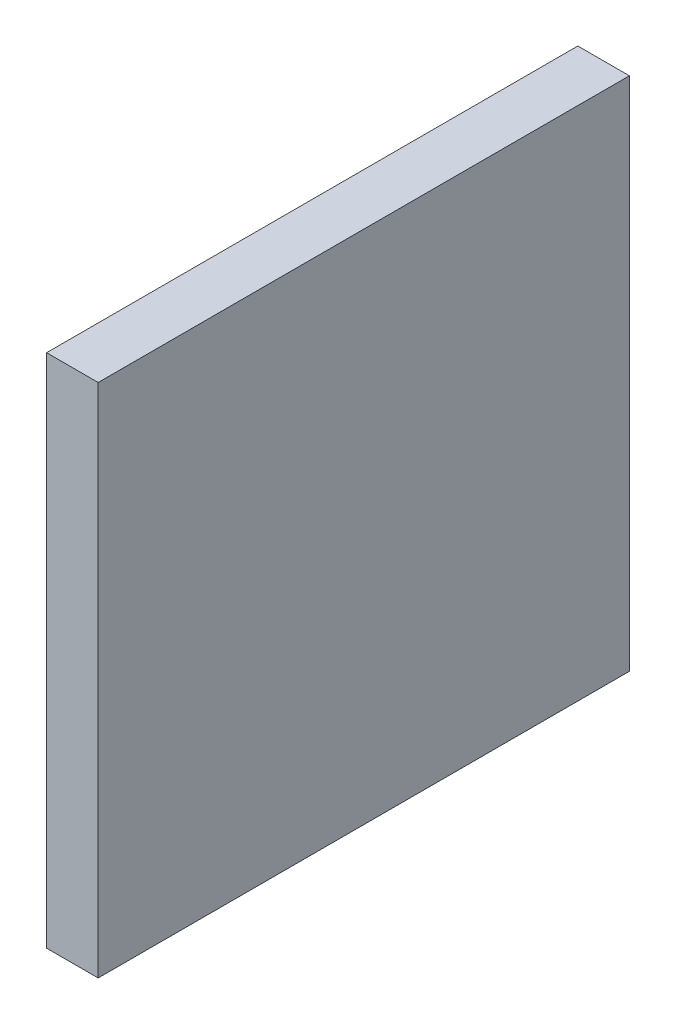
ISO-10303-21;
HEADER;
FILE_DESCRIPTION(('STEP AP214'),'2;1');
FILE_NAME('part.step','',(''),(''),'','','');
FILE_SCHEMA(('AUTOMOTIVE_DESIGN { 1 0 10303 214 1 1 1 1 }'));
ENDSEC;
DATA;
#1=APPLICATION_CONTEXT('core data for automotive mechanical design processes');
#2=APPLICATION_PROTOCOL_DEFINITION('international standard','automotive_design',2000,#1);
#3=PRODUCT_CONTEXT('',#1,'mechanical');
#4=PRODUCT('Part','Part','',(#3));
#5=PRODUCT_RELATED_PRODUCT_CATEGORY('part','',(#4));
#6=PRODUCT_DEFINITION_FORMATION('','',#4);
#7=PRODUCT_DEFINITION_CONTEXT('part definition',#1,'design');
#8=PRODUCT_DEFINITION('design','',#6,#7);
#9=PRODUCT_DEFINITION_SHAPE('','',#8);
#10=(LENGTH_UNIT() NAMED_UNIT(*) SI_UNIT(.MILLI.,.METRE.));
#11=(NAMED_UNIT(*) PLANE_ANGLE_UNIT() SI_UNIT($,.RADIAN.));
#12=(NAMED_UNIT(*) SI_UNIT($,.STERADIAN.) SOLID_ANGLE_UNIT());
#13=UNCERTAINTY_MEASURE_WITH_UNIT(LENGTH_MEASURE(1.E-05),#10,'distance_accuracy_value','');
#14=(GEOMETRIC_REPRESENTATION_CONTEXT(3) GLOBAL_UNCERTAINTY_ASSIGNED_CONTEXT((#13)) GLOBAL_UNIT_ASSIGNED_CONTEXT((#10,
#11,#12)) REPRESENTATION_CONTEXT('',''));
#15=CARTESIAN_POINT('',(0.,0.,0.));
#16=DIRECTION('',(0.,0.,1.));
#17=DIRECTION('',(1.,0.,0.));
#18=AXIS2_PLACEMENT_3D('',#15,#16,#17);
#19=CARTESIAN_POINT('',(1.,5.,-5.15));
#20=DIRECTION('',(0.,0.,1.));
#21=DIRECTION('',(0.,-1.,0.));
#22=AXIS2_PLACEMENT_3D('',#19,#20,#21);
#23=PLANE('',#22);
#24=DIRECTION('',(0.,1.,0.));
#25=VECTOR('',#24,1.);
#26=CARTESIAN_POINT('',(0.,5.,-5.15));
#27=LINE('',#26,#25);
#28=CARTESIAN_POINT('',(0.,-5.,-5.15));
#29=VERTEX_POINT('',#28);
#30=CARTESIAN_POINT('',(0.,5.,-5.15));
#31=VERTEX_POINT('',#30);
#32=EDGE_CURVE('E96',#29,#31,#27,.T.);
#33=ORIENTED_EDGE('',*,*,#32,.T.);
#34=DIRECTION('',(-1.,0.,0.));
#35=VECTOR('',#34,1.);
#36=CARTESIAN_POINT('',(1.,5.,-5.15));
#37=LINE('',#36,#35);
#38=CARTESIAN_POINT('',(1.,5.,-5.15));
#39=VERTEX_POINT('',#38);
#40=EDGE_CURVE('E11',#39,#31,#37,.T.);
#41=ORIENTED_EDGE('',*,*,#40,.F.);
#42=DIRECTION('',(0.,1.,0.));
#43=VECTOR('',#42,1.);
#44=CARTESIAN_POINT('',(1.,5.,-5.15));
#45=LINE('',#44,#43);
#46=CARTESIAN_POINT('',(1.,-5.,-5.15));
#47=VERTEX_POINT('',#46);
#48=EDGE_CURVE('E84',#47,#39,#45,.T.);
#49=ORIENTED_EDGE('',*,*,#48,.F.);
#50=DIRECTION('',(-1.,0.,0.));
#51=VECTOR('',#50,1.);
#52=CARTESIAN_POINT('',(1.,-5.,-5.15));
#53=LINE('',#52,#51);
#54=EDGE_CURVE('E92',#47,#29,#53,.T.);
#55=ORIENTED_EDGE('',*,*,#54,.T.);
#56=EDGE_LOOP('',(#33,#41,#49,#55));
#57=FACE_BOUND('',#56,.T.);
#58=ADVANCED_FACE('F33',(#57),#23,.F.);
#59=CARTESIAN_POINT('',(1.,5.,5.15));
#60=DIRECTION('',(0.,-1.,0.));
#61=DIRECTION('',(0.,0.,-1.));
#62=AXIS2_PLACEMENT_3D('',#59,#60,#61);
#63=PLANE('',#62);
#64=DIRECTION('',(0.,0.,1.));
#65=VECTOR('',#64,1.);
#66=CARTESIAN_POINT('',(0.,5.,5.15));
#67=LINE('',#66,#65);
#68=CARTESIAN_POINT('',(0.,5.,5.15));
#69=VERTEX_POINT('',#68);
#70=EDGE_CURVE('E88',#31,#69,#67,.T.);
#71=ORIENTED_EDGE('',*,*,#70,.T.);
#72=DIRECTION('',(-1.,0.,0.));
#73=VECTOR('',#72,1.);
#74=CARTESIAN_POINT('',(1.,5.,5.15));
#75=LINE('',#74,#73);
#76=CARTESIAN_POINT('',(1.,5.,5.15));
#77=VERTEX_POINT('',#76);
#78=EDGE_CURVE('E41',#77,#69,#75,.T.);
#79=ORIENTED_EDGE('',*,*,#78,.F.);
#80=DIRECTION('',(0.,0.,1.));
#81=VECTOR('',#80,1.);
#82=CARTESIAN_POINT('',(1.,5.,5.15));
#83=LINE('',#82,#81);
#84=EDGE_CURVE('E79',#39,#77,#83,.T.);
#85=ORIENTED_EDGE('',*,*,#84,.F.);
#86=ORIENTED_EDGE('',*,*,#40,.T.);
#87=EDGE_LOOP('',(#71,#79,#85,#86));
#88=FACE_BOUND('',#87,.T.);
#89=ADVANCED_FACE('F87',(#88),#63,.F.);
#90=CARTESIAN_POINT('',(1.,5.,5.15));
#91=DIRECTION('',(0.,0.,-1.));
#92=DIRECTION('',(-1.,0.,0.));
#93=AXIS2_PLACEMENT_3D('',#90,#91,#92);
#94=PLANE('',#93);
#95=DIRECTION('',(0.,-1.,0.));
#96=VECTOR('',#95,1.);
#97=CARTESIAN_POINT('',(0.,5.,5.15));
#98=LINE('',#97,#96);
#99=CARTESIAN_POINT('',(0.,-5.,5.15));
#100=VERTEX_POINT('',#99);
#101=EDGE_CURVE('E66',#69,#100,#98,.T.);
#102=ORIENTED_EDGE('',*,*,#101,.T.);
#103=DIRECTION('',(-1.,0.,0.));
#104=VECTOR('',#103,1.);
#105=CARTESIAN_POINT('',(1.,-5.,5.15));
#106=LINE('',#105,#104);
#107=CARTESIAN_POINT('',(1.,-5.,5.15));
#108=VERTEX_POINT('',#107);
#109=EDGE_CURVE('E89',#108,#100,#106,.T.);
#110=ORIENTED_EDGE('',*,*,#109,.F.);
#111=DIRECTION('',(0.,-1.,0.));
#112=VECTOR('',#111,1.);
#113=CARTESIAN_POINT('',(1.,5.,5.15));
#114=LINE('',#113,#112);
#115=EDGE_CURVE('E82',#77,#108,#114,.T.);
#116=ORIENTED_EDGE('',*,*,#115,.F.);
#117=ORIENTED_EDGE('',*,*,#78,.T.);
#118=EDGE_LOOP('',(#102,#110,#116,#117));
#119=FACE_BOUND('',#118,.T.);
#120=ADVANCED_FACE('F90',(#119),#94,.F.);
#121=CARTESIAN_POINT('',(1.,-5.,5.15));
#122=DIRECTION('',(0.,1.,0.));
#123=DIRECTION('',(0.,0.,1.));
#124=AXIS2_PLACEMENT_3D('',#121,#122,#123);
#125=PLANE('',#124);
#126=DIRECTION('',(0.,0.,-1.));
#127=VECTOR('',#126,1.);
#128=CARTESIAN_POINT('',(0.,-5.,5.15));
#129=LINE('',#128,#127);
#130=EDGE_CURVE('E72',#100,#29,#129,.T.);
#131=ORIENTED_EDGE('',*,*,#130,.T.);
#132=ORIENTED_EDGE('',*,*,#54,.F.);
#133=DIRECTION('',(0.,0.,-1.));
#134=VECTOR('',#133,1.);
#135=CARTESIAN_POINT('',(1.,-5.,5.15));
#136=LINE('',#135,#134);
#137=EDGE_CURVE('E49',#108,#47,#136,.T.);
#138=ORIENTED_EDGE('',*,*,#137,.F.);
#139=ORIENTED_EDGE('',*,*,#109,.T.);
#140=EDGE_LOOP('',(#131,#132,#138,#139));
#141=FACE_BOUND('',#140,.T.);
#142=ADVANCED_FACE('F103',(#141),#125,.F.);
#143=CARTESIAN_POINT('',(1.,0.,0.));
#144=DIRECTION('',(1.,0.,0.));
#145=DIRECTION('',(0.,0.,-1.));
#146=AXIS2_PLACEMENT_3D('',#143,#144,#145);
#147=PLANE('',#146);
#148=ORIENTED_EDGE('',*,*,#48,.T.);
#149=ORIENTED_EDGE('',*,*,#84,.T.);
#150=ORIENTED_EDGE('',*,*,#115,.T.);
#151=ORIENTED_EDGE('',*,*,#137,.T.);
#152=EDGE_LOOP('',(#148,#149,#150,#151));
#153=FACE_BOUND('',#152,.T.);
#154=ADVANCED_FACE('F80',(#153),#147,.T.);
#155=CARTESIAN_POINT('',(0.,0.,0.));
#156=DIRECTION('',(1.,0.,0.));
#157=DIRECTION('',(0.,0.,-1.));
#158=AXIS2_PLACEMENT_3D('',#155,#156,#157);
#159=PLANE('',#158);
#160=ORIENTED_EDGE('',*,*,#32,.F.);
#161=ORIENTED_EDGE('',*,*,#130,.F.);
#162=ORIENTED_EDGE('',*,*,#101,.F.);
#163=ORIENTED_EDGE('',*,*,#70,.F.);
#164=EDGE_LOOP('',(#160,#161,#162,#163));
#165=FACE_BOUND('',#164,.T.);
#166=ADVANCED_FACE('F106',(#165),#159,.F.);
#167=CLOSED_SHELL('',(#58,#89,#120,#142,#154,#166));
#168=MANIFOLD_SOLID_BREP('B2',#167);
#169=ADVANCED_BREP_SHAPE_REPRESENTATION('',(#18,#168),#14);
#170=SHAPE_DEFINITION_REPRESENTATION(#9,#169);
ENDSEC;
END-ISO-10303-21;
